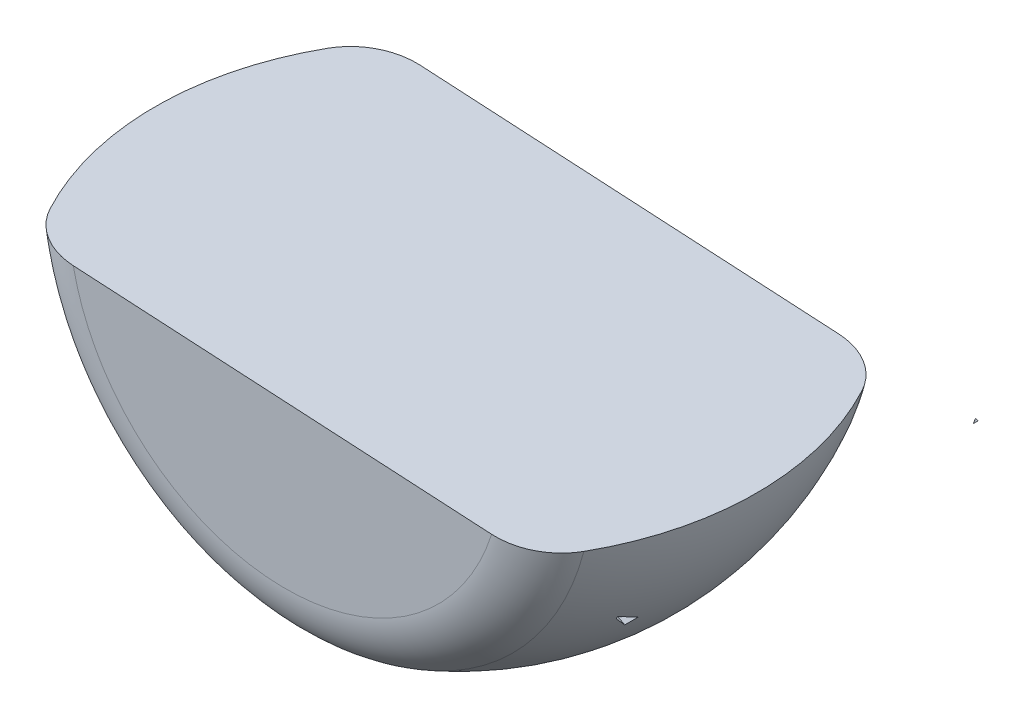
ISO-10303-21;
HEADER;
FILE_DESCRIPTION(('STEP AP214'),'2;1');
FILE_NAME('part.step','',(''),(''),'','','');
FILE_SCHEMA(('AUTOMOTIVE_DESIGN { 1 0 10303 214 1 1 1 1 }'));
ENDSEC;
DATA;
#1=APPLICATION_CONTEXT('core data for automotive mechanical design processes');
#2=APPLICATION_PROTOCOL_DEFINITION('international standard','automotive_design',2000,#1);
#3=PRODUCT_CONTEXT('',#1,'mechanical');
#4=PRODUCT('Part','Part','',(#3));
#5=PRODUCT_RELATED_PRODUCT_CATEGORY('part','',(#4));
#6=PRODUCT_DEFINITION_FORMATION('','',#4);
#7=PRODUCT_DEFINITION_CONTEXT('part definition',#1,'design');
#8=PRODUCT_DEFINITION('design','',#6,#7);
#9=PRODUCT_DEFINITION_SHAPE('','',#8);
#10=(LENGTH_UNIT() NAMED_UNIT(*) SI_UNIT(.MILLI.,.METRE.));
#11=(NAMED_UNIT(*) PLANE_ANGLE_UNIT() SI_UNIT($,.RADIAN.));
#12=(NAMED_UNIT(*) SI_UNIT($,.STERADIAN.) SOLID_ANGLE_UNIT());
#13=UNCERTAINTY_MEASURE_WITH_UNIT(LENGTH_MEASURE(1.E-05),#10,'distance_accuracy_value','');
#14=(GEOMETRIC_REPRESENTATION_CONTEXT(3) GLOBAL_UNCERTAINTY_ASSIGNED_CONTEXT((#13)) GLOBAL_UNIT_ASSIGNED_CONTEXT((#10,
#11,#12)) REPRESENTATION_CONTEXT('',''));
#15=CARTESIAN_POINT('',(0.,0.,0.));
#16=DIRECTION('',(0.,0.,1.));
#17=DIRECTION('',(1.,0.,0.));
#18=AXIS2_PLACEMENT_3D('',#15,#16,#17);
#19=CARTESIAN_POINT('',(0.,0.,-8.55000000000001));
#20=DIRECTION('',(0.,0.,1.));
#21=DIRECTION('',(1.,0.,0.));
#22=AXIS2_PLACEMENT_3D('',#19,#20,#21);
#23=PLANE('',#22);
#24=DIRECTION('',(-0.998432153015849,0.0559753144174939,0.));
#25=VECTOR('',#24,1.);
#26=CARTESIAN_POINT('',(0.129132371159145,2.30333518805877,-8.55000000000001));
#27=LINE('',#26,#25);
#28=CARTESIAN_POINT('',(18.1091829067,1.29531578590981,-8.55000000000001));
#29=VERTEX_POINT('',#28);
#30=CARTESIAN_POINT('',(-16.9696653101634,3.26194872377285,-8.55000000000001));
#31=VERTEX_POINT('',#30);
#32=EDGE_CURVE('E213',#29,#31,#27,.T.);
#33=ORIENTED_EDGE('',*,*,#32,.F.);
#34=CARTESIAN_POINT('',(0.826261676156741,6.85387624033769,-8.55000000000001));
#35=DIRECTION('',(0.,0.,1.));
#36=DIRECTION('',(1.,0.,0.));
#37=AXIS2_PLACEMENT_3D('',#34,#35,#36);
#38=CIRCLE('',#37,18.154805440618);
#39=EDGE_CURVE('E217',#29,#31,#38,.F.);
#40=ORIENTED_EDGE('',*,*,#39,.T.);
#41=EDGE_LOOP('',(#33,#40));
#42=FACE_BOUND('',#41,.T.);
#43=ADVANCED_FACE('F160',(#42),#23,.F.);
#44=CARTESIAN_POINT('',(0.125498784377637,2.23852287014352,20.55));
#45=DIRECTION('',(0.,0.,-1.));
#46=DIRECTION('',(-1.,0.,0.));
#47=AXIS2_PLACEMENT_3D('',#44,#45,#46);
#48=PLANE('',#47);
#49=DIRECTION('',(-0.998432153015849,0.0559753144174939,0.));
#50=VECTOR('',#49,1.);
#51=CARTESIAN_POINT('',(0.129132371159145,2.30333518805877,20.55));
#52=LINE('',#51,#50);
#53=CARTESIAN_POINT('',(18.1091829067,1.29531578590981,20.55));
#54=VERTEX_POINT('',#53);
#55=CARTESIAN_POINT('',(-16.9696653101634,3.26194872377285,20.55));
#56=VERTEX_POINT('',#55);
#57=EDGE_CURVE('E181',#54,#56,#52,.T.);
#58=ORIENTED_EDGE('',*,*,#57,.T.);
#59=CARTESIAN_POINT('',(0.826261676156741,6.85387624033769,20.55));
#60=DIRECTION('',(0.,0.,-1.));
#61=DIRECTION('',(-1.,0.,0.));
#62=AXIS2_PLACEMENT_3D('',#59,#60,#61);
#63=CIRCLE('',#62,18.154805440618);
#64=EDGE_CURVE('E211',#56,#54,#63,.F.);
#65=ORIENTED_EDGE('',*,*,#64,.T.);
#66=EDGE_LOOP('',(#58,#65));
#67=FACE_BOUND('',#66,.T.);
#68=ADVANCED_FACE('F210',(#67),#48,.F.);
#69=CARTESIAN_POINT('',(0.826261676156741,6.85387624033769,5.99999999999999));
#70=DIRECTION('',(0.,0.,1.));
#71=DIRECTION('',(-0.996032291105332,-0.088992556292444,0.));
#72=AXIS2_PLACEMENT_3D('',#69,#70,#71);
#73=SPHERICAL_SURFACE('',#72,25.6754622177435);
#74=CARTESIAN_POINT('',(0.56975879826831,2.27863225484133,5.99999999999999));
#75=DIRECTION('',(0.0559753144174939,0.998432153015849,0.));
#76=DIRECTION('',(-0.998432153015849,0.0559753144174939,0.));
#77=AXIS2_PLACEMENT_3D('',#74,#75,#76);
#78=CIRCLE('',#77,25.2632283930932);
#79=CARTESIAN_POINT('',(-21.8086340431101,3.53323685833958,-5.65608038610815));
#80=VERTEX_POINT('',#79);
#81=CARTESIAN_POINT('',(-21.8086340431116,3.53323685833966,17.6560803861092));
#82=VERTEX_POINT('',#81);
#83=EDGE_CURVE('E187',#80,#82,#78,.T.);
#84=ORIENTED_EDGE('',*,*,#83,.F.);
#85=CARTESIAN_POINT('',(0.826261676156741,6.85387624033769,-5.65608038610814));
#86=DIRECTION('',(0.,0.,1.));
#87=DIRECTION('',(1.,0.,0.));
#88=AXIS2_PLACEMENT_3D('',#85,#86,#87);
#89=CIRCLE('',#88,22.8771753091888);
#90=CARTESIAN_POINT('',(22.9481516396467,1.02402765134308,-5.65608038610814));
#91=VERTEX_POINT('',#90);
#92=EDGE_CURVE('E224',#80,#91,#89,.T.);
#93=ORIENTED_EDGE('',*,*,#92,.T.);
#94=CARTESIAN_POINT('',(22.9481516396467,1.02402765134308,17.6560803861081));
#95=VERTEX_POINT('',#94);
#96=EDGE_CURVE('E266',#95,#91,#78,.T.);
#97=ORIENTED_EDGE('',*,*,#96,.F.);
#98=CARTESIAN_POINT('',(0.826261676156741,6.85387624033769,17.6560803861081));
#99=DIRECTION('',(0.,0.,-1.));
#100=DIRECTION('',(-1.,0.,0.));
#101=AXIS2_PLACEMENT_3D('',#98,#99,#100);
#102=CIRCLE('',#101,22.8771753091888);
#103=EDGE_CURVE('E268',#95,#82,#102,.T.);
#104=ORIENTED_EDGE('',*,*,#103,.T.);
#105=EDGE_LOOP('',(#84,#93,#97,#104));
#106=FACE_BOUND('',#105,.T.);
#107=ADVANCED_FACE('F243',(#106),#73,.T.);
#108=CARTESIAN_POINT('',(0.826261676156741,6.85387624033769,-3.25000000000001));
#109=DIRECTION('',(0.,0.,1.));
#110=DIRECTION('',(1.,0.,0.));
#111=AXIS2_PLACEMENT_3D('',#108,#109,#110);
#112=TOROIDAL_SURFACE('',#111,18.154805440618,5.3);
#113=CARTESIAN_POINT('',(-16.9696653101634,3.26194872377285,-8.55000000000001));
#114=CARTESIAN_POINT('',(-17.1256787658121,3.27069533936102,-8.55001482433052));
#115=CARTESIAN_POINT('',(-17.2816969424525,3.27944221962315,-8.54353039531665));
#116=CARTESIAN_POINT('',(-17.5926681468622,3.29687626447941,-8.51760011258737));
#117=CARTESIAN_POINT('',(-17.7476210853061,3.30556342406568,-8.4981531849808));
#118=CARTESIAN_POINT('',(-18.0553608761441,3.32281630549473,-8.44633501946241));
#119=CARTESIAN_POINT('',(-18.2081477304032,3.33138202744207,-8.41396379267852));
#120=CARTESIAN_POINT('',(-18.5104505987456,3.34833009752741,-8.33644732990927));
#121=CARTESIAN_POINT('',(-18.6599667697709,3.3567124544641,-8.29130270830324));
#122=CARTESIAN_POINT('',(-18.9547935918192,3.37324139337398,-8.18842033777883));
#123=CARTESIAN_POINT('',(-19.1000996984711,3.38138772057514,-8.13066951617046));
#124=CARTESIAN_POINT('',(-19.385253243436,3.39737434449191,-8.00293632378373));
#125=CARTESIAN_POINT('',(-19.5251006703919,3.40521464057081,-7.93295392755856));
#126=CARTESIAN_POINT('',(-19.7982742754338,3.42052963056446,-7.7811856290846));
#127=CARTESIAN_POINT('',(-19.9315999710766,3.4280042974319,-7.69939885537312));
#128=CARTESIAN_POINT('',(-20.1906681270639,3.44252849063135,-7.52456450837469));
#129=CARTESIAN_POINT('',(-20.3164110661033,3.44957804380054,-7.43151764704788));
#130=CARTESIAN_POINT('',(-20.556980041534,3.46306511350092,-7.2366889601152));
#131=CARTESIAN_POINT('',(-20.6719695274595,3.46951179353816,-7.13510954903656));
#132=CARTESIAN_POINT('',(-20.8927934900615,3.4818918943795,-6.92242140821484));
#133=CARTESIAN_POINT('',(-20.9986284985892,3.48782534500088,-6.81131323281591));
#134=CARTESIAN_POINT('',(-21.2001308149967,3.49912221227692,-6.5805486796643));
#135=CARTESIAN_POINT('',(-21.2958152999322,3.50448659193253,-6.46090733508248));
#136=CARTESIAN_POINT('',(-21.4764149844249,3.51461159050419,-6.2138127239095));
#137=CARTESIAN_POINT('',(-21.5613369383629,3.51937258809252,-6.08636443207877));
#138=CARTESIAN_POINT('',(-21.6701882999004,3.52547514515504,-5.90649510556245));
#139=CARTESIAN_POINT('',(-21.6990407071703,3.52709270380813,-5.85701261974586));
#140=CARTESIAN_POINT('',(-21.7550804451243,3.5302344715711,-5.7571920202053));
#141=CARTESIAN_POINT('',(-21.7822698100869,3.53175879472915,-5.70685505211208));
#142=CARTESIAN_POINT('',(-21.8086340431101,3.53323685833958,-5.65608038610814));
#143=B_SPLINE_CURVE_WITH_KNOTS('',3,(#113,#114,#115,#116,#117,#118,#119,#120,#121,#122,#123,
#124,#125,#126,#127,#128,#129,#130,#131,#132,#133,#134,#135,#136,#137,#138,#139,#140,#141,#142),
.UNSPECIFIED.,.F.,.F.,(4,2,2,2,2,2,2,2,2,2,2,2,2,2,4),(0.,0.468648058407676,0.937334947259083,
1.40602143256798,1.87468537865678,2.34383766011885,2.81299091762602,3.28217882828491,
3.75133708831051,4.21147217405171,4.67158050916942,5.1308973775576,5.58992454383809,
5.76180889021346,5.93347859538394),.UNSPECIFIED.);
#144=EDGE_CURVE('E221',#31,#80,#143,.T.);
#145=ORIENTED_EDGE('',*,*,#144,.F.);
#146=ORIENTED_EDGE('',*,*,#39,.F.);
#147=CARTESIAN_POINT('',(22.9481516396467,1.02402765134308,-5.65608038610814));
#148=CARTESIAN_POINT('',(22.8791205738024,1.02789775468815,-5.78906738389804));
#149=CARTESIAN_POINT('',(22.8043770049273,1.03208811930715,-5.91907063165377));
#150=CARTESIAN_POINT('',(22.644125947754,1.04107230845202,-6.17221746019535));
#151=CARTESIAN_POINT('',(22.5586200172717,1.04586604564171,-6.29536203003823));
#152=CARTESIAN_POINT('',(22.3776539264006,1.05601158613219,-6.53371578201796));
#153=CARTESIAN_POINT('',(22.2822126316176,1.06136233176649,-6.64893933791777));
#154=CARTESIAN_POINT('',(22.0819777963415,1.07258813997795,-6.87092349782591));
#155=CARTESIAN_POINT('',(21.9771841688112,1.07846320743471,-6.97768402305583));
#156=CARTESIAN_POINT('',(21.7590636983975,1.09069174181776,-7.18200422283819));
#157=CARTESIAN_POINT('',(21.6457391907857,1.09704507782123,-7.27956639902427));
#158=CARTESIAN_POINT('',(21.4113309394722,1.11018675753346,-7.46492811703339));
#159=CARTESIAN_POINT('',(21.2902445128021,1.11697525165805,-7.55272425415191));
#160=CARTESIAN_POINT('',(21.041193338978,1.1309378606533,-7.71799361789004));
#161=CARTESIAN_POINT('',(20.9132266092826,1.13811208667161,-7.79546384651136));
#162=CARTESIAN_POINT('',(20.6513596027075,1.1527931924276,-7.93959146972177));
#163=CARTESIAN_POINT('',(20.5174591818864,1.16030008023511,-8.00624860182025));
#164=CARTESIAN_POINT('',(20.2423590765729,1.17572307602375,-8.12940335475971));
#165=CARTESIAN_POINT('',(20.1010742809344,1.1836439556092,-8.18571025583881));
#166=CARTESIAN_POINT('',(19.8143909211821,1.19971634585817,-8.28642526333083));
#167=CARTESIAN_POINT('',(19.6689936809068,1.20786778230307,-8.33083715174082));
#168=CARTESIAN_POINT('',(19.3751982896949,1.22433889588632,-8.40752788457482));
#169=CARTESIAN_POINT('',(19.2268031355116,1.23265840501706,-8.43981826922203));
#170=CARTESIAN_POINT('',(18.9279376462518,1.24941376458689,-8.49217654338016));
#171=CARTESIAN_POINT('',(18.7774683266254,1.25784955809658,-8.51225021069916));
#172=CARTESIAN_POINT('',(18.5404154814424,1.2711395022381,-8.53413937553156));
#173=CARTESIAN_POINT('',(18.4541926230555,1.27597343270959,-8.54009441299618));
#174=CARTESIAN_POINT('',(18.2817102480092,1.28564334883312,-8.54802148659344));
#175=CARTESIAN_POINT('',(18.195451038521,1.29047931726414,-8.55000022439096));
#176=CARTESIAN_POINT('',(18.1091829067,1.29531578590981,-8.55000000000001));
#177=B_SPLINE_CURVE_WITH_KNOTS('',3,(#147,#148,#149,#150,#151,#152,#153,#154,#155,#156,#157,
#158,#159,#160,#161,#162,#163,#164,#165,#166,#167,#168,#169,#170,#171,#172,#173,#174,#175,#176),
.UNSPECIFIED.,.F.,.F.,(4,2,2,2,2,2,2,2,2,2,2,2,2,2,4),(0.,0.449509095355429,0.898953200429437,
1.34755893657672,1.79616884809569,2.24465639911111,2.69329981815641,3.14207321277775,
3.59085749985546,4.047225738026,4.50344870205021,4.95923621280154,5.41480799429213,
5.6744159188896,5.93358593146417),.UNSPECIFIED.);
#178=EDGE_CURVE('E216',#91,#29,#177,.T.);
#179=ORIENTED_EDGE('',*,*,#178,.F.);
#180=ORIENTED_EDGE('',*,*,#92,.F.);
#181=EDGE_LOOP('',(#145,#146,#179,#180));
#182=FACE_BOUND('',#181,.T.);
#183=ADVANCED_FACE('F239',(#182),#112,.T.);
#184=CARTESIAN_POINT('',(0.826261676156741,6.85387624033769,15.25));
#185=DIRECTION('',(0.,0.,-1.));
#186=DIRECTION('',(-1.,0.,0.));
#187=AXIS2_PLACEMENT_3D('',#184,#185,#186);
#188=TOROIDAL_SURFACE('',#187,18.154805440618,5.3);
#189=CARTESIAN_POINT('',(-21.8086340431101,3.53323685833958,17.6560803861081));
#190=CARTESIAN_POINT('',(-21.7396029772658,3.52936675499451,17.789067383898));
#191=CARTESIAN_POINT('',(-21.6648594083907,3.52517639037551,17.9190706316538));
#192=CARTESIAN_POINT('',(-21.5046083512174,3.51619220123064,18.1722174601953));
#193=CARTESIAN_POINT('',(-21.4191024207351,3.51139846404094,18.2953620300382));
#194=CARTESIAN_POINT('',(-21.238136329864,3.50125292355046,18.5337157820179));
#195=CARTESIAN_POINT('',(-21.1426950350809,3.49590217791617,18.6489393379178));
#196=CARTESIAN_POINT('',(-20.9424601998049,3.4846763697047,18.8709234978259));
#197=CARTESIAN_POINT('',(-20.8376665722746,3.47880130224795,18.9776840230558));
#198=CARTESIAN_POINT('',(-20.6195461018609,3.4665727678649,19.1820042228382));
#199=CARTESIAN_POINT('',(-20.506221594249,3.46021943186143,19.2795663990243));
#200=CARTESIAN_POINT('',(-20.2718133429356,3.4470777521492,19.4649281170334));
#201=CARTESIAN_POINT('',(-20.1507269162655,3.44028925802461,19.5527242541519));
#202=CARTESIAN_POINT('',(-19.9016757424414,3.42632664902936,19.71799361789));
#203=CARTESIAN_POINT('',(-19.773709012746,3.41915242301105,19.7954638465113));
#204=CARTESIAN_POINT('',(-19.5118420061709,3.40447131725506,19.9395914697218));
#205=CARTESIAN_POINT('',(-19.3779415853498,3.39696442944755,20.0062486018202));
#206=CARTESIAN_POINT('',(-19.1028414800362,3.38154143365891,20.1294033547597));
#207=CARTESIAN_POINT('',(-18.9615566843978,3.37362055407346,20.1857102558388));
#208=CARTESIAN_POINT('',(-18.6748733246455,3.35754816382448,20.2864252633308));
#209=CARTESIAN_POINT('',(-18.5294760843702,3.34939672737959,20.3308371517408));
#210=CARTESIAN_POINT('',(-18.2356806931583,3.33292561379634,20.4075278845748));
#211=CARTESIAN_POINT('',(-18.087285538975,3.32460610466559,20.439818269222));
#212=CARTESIAN_POINT('',(-17.7884200497152,3.30785074509577,20.4921765433802));
#213=CARTESIAN_POINT('',(-17.6379507300888,3.29941495158608,20.5122502106991));
#214=CARTESIAN_POINT('',(-17.4008978849058,3.28612500744456,20.5341393755315));
#215=CARTESIAN_POINT('',(-17.3146750265189,3.28129107697307,20.5400944129962));
#216=CARTESIAN_POINT('',(-17.1421926514725,3.27162116084954,20.5480214865934));
#217=CARTESIAN_POINT('',(-17.0559334419844,3.26678519241852,20.5500002243909));
#218=CARTESIAN_POINT('',(-16.9696653101634,3.26194872377285,20.55));
#219=B_SPLINE_CURVE_WITH_KNOTS('',3,(#189,#190,#191,#192,#193,#194,#195,#196,#197,#198,#199,
#200,#201,#202,#203,#204,#205,#206,#207,#208,#209,#210,#211,#212,#213,#214,#215,#216,#217,#218),
.UNSPECIFIED.,.F.,.F.,(4,2,2,2,2,2,2,2,2,2,2,2,2,2,4),(0.,0.449509095355429,0.898953200429435,
1.34755893657672,1.79616884809569,2.24465639911111,2.6932998181564,3.14207321277775,
3.59085749985546,4.047225738026,4.50344870205021,4.95923621280154,5.41480799429213,
5.6744159188896,5.93358593146417),.UNSPECIFIED.);
#220=EDGE_CURVE('E13',#82,#56,#219,.T.);
#221=ORIENTED_EDGE('',*,*,#220,.F.);
#222=ORIENTED_EDGE('',*,*,#103,.F.);
#223=CARTESIAN_POINT('',(18.1091829067,1.29531578590981,20.55));
#224=CARTESIAN_POINT('',(18.2651963623487,1.28656917032164,20.5500148243305));
#225=CARTESIAN_POINT('',(18.4212145389891,1.27782229005951,20.5435303953166));
#226=CARTESIAN_POINT('',(18.7321857433988,1.26038824520324,20.5176001125874));
#227=CARTESIAN_POINT('',(18.8871386818427,1.25170108561697,20.4981531849808));
#228=CARTESIAN_POINT('',(19.1948784726807,1.23444820418792,20.4463350194624));
#229=CARTESIAN_POINT('',(19.3476653269398,1.22588248224059,20.4139637926785));
#230=CARTESIAN_POINT('',(19.6499681952822,1.20893441215525,20.3364473299093));
#231=CARTESIAN_POINT('',(19.7994843663075,1.20055205521856,20.2913027083032));
#232=CARTESIAN_POINT('',(20.0943111883558,1.18402311630868,20.1884203377788));
#233=CARTESIAN_POINT('',(20.2396172950077,1.17587678910752,20.1306695161704));
#234=CARTESIAN_POINT('',(20.5247708399726,1.15989016519075,20.0029363237837));
#235=CARTESIAN_POINT('',(20.6646182669286,1.15204986911185,19.9329539275586));
#236=CARTESIAN_POINT('',(20.9377918719704,1.1367348791182,19.7811856290846));
#237=CARTESIAN_POINT('',(21.0711175676133,1.12926021225076,19.6993988553731));
#238=CARTESIAN_POINT('',(21.3301857236005,1.1147360190513,19.5245645083747));
#239=CARTESIAN_POINT('',(21.4559286626399,1.10768646588212,19.4315176470479));
#240=CARTESIAN_POINT('',(21.6964976380706,1.09419939618173,19.2366889601152));
#241=CARTESIAN_POINT('',(21.8114871239961,1.08775271614449,19.1351095490365));
#242=CARTESIAN_POINT('',(22.0323110865982,1.07537261530316,18.9224214082148));
#243=CARTESIAN_POINT('',(22.1381460951258,1.06943916468178,18.8113132328159));
#244=CARTESIAN_POINT('',(22.3396484115333,1.05814229740573,18.5805486796643));
#245=CARTESIAN_POINT('',(22.4353328964688,1.05277791775013,18.4609073350825));
#246=CARTESIAN_POINT('',(22.6159325809615,1.04265291917847,18.2138127239095));
#247=CARTESIAN_POINT('',(22.7008545348995,1.03789192159014,18.0863644320788));
#248=CARTESIAN_POINT('',(22.809705896437,1.03178936452762,17.9064951055624));
#249=CARTESIAN_POINT('',(22.8385583037069,1.03017180587453,17.8570126197459));
#250=CARTESIAN_POINT('',(22.8945980416609,1.02703003811156,17.7571920202053));
#251=CARTESIAN_POINT('',(22.9217874066235,1.0255057149535,17.7068550521121));
#252=CARTESIAN_POINT('',(22.9481516396467,1.02402765134308,17.6560803861081));
#253=B_SPLINE_CURVE_WITH_KNOTS('',3,(#223,#224,#225,#226,#227,#228,#229,#230,#231,#232,#233,
#234,#235,#236,#237,#238,#239,#240,#241,#242,#243,#244,#245,#246,#247,#248,#249,#250,#251,#252),
.UNSPECIFIED.,.F.,.F.,(4,2,2,2,2,2,2,2,2,2,2,2,2,2,4),(0.,0.468648058407676,0.937334947259083,
1.40602143256799,1.87468537865678,2.34383766011885,2.81299091762602,3.28217882828491,
3.7513370883105,4.2114721740517,4.67158050916941,5.1308973775576,5.58992454383809,
5.76180889021346,5.93347859538393),.UNSPECIFIED.);
#254=EDGE_CURVE('E175',#54,#95,#253,.T.);
#255=ORIENTED_EDGE('',*,*,#254,.F.);
#256=ORIENTED_EDGE('',*,*,#64,.F.);
#257=EDGE_LOOP('',(#221,#222,#255,#256));
#258=FACE_BOUND('',#257,.T.);
#259=ADVANCED_FACE('F162',(#258),#188,.T.);
#260=CARTESIAN_POINT('',(0.129132371159145,2.30333518805877,-27.7));
#261=DIRECTION('',(0.0559753144174939,0.998432153015849,0.));
#262=DIRECTION('',(-0.998432153015849,0.0559753144174939,0.));
#263=AXIS2_PLACEMENT_3D('',#260,#261,#262);
#264=PLANE('',#263);
#265=ORIENTED_EDGE('',*,*,#83,.T.);
#266=ORIENTED_EDGE('',*,*,#220,.T.);
#267=ORIENTED_EDGE('',*,*,#57,.F.);
#268=ORIENTED_EDGE('',*,*,#254,.T.);
#269=ORIENTED_EDGE('',*,*,#96,.T.);
#270=ORIENTED_EDGE('',*,*,#178,.T.);
#271=ORIENTED_EDGE('',*,*,#32,.T.);
#272=ORIENTED_EDGE('',*,*,#144,.T.);
#273=EDGE_LOOP('',(#265,#266,#267,#268,#269,#270,#271,#272));
#274=FACE_BOUND('',#273,.T.);
#275=ADVANCED_FACE('F204',(#274),#264,.T.);
#276=CLOSED_SHELL('',(#43,#68,#107,#183,#259,#275));
#277=MANIFOLD_SOLID_BREP('B2',#276);
#278=CARTESIAN_POINT('',(6.56743620719669,12.4703762315739,0.));
#279=DIRECTION('',(0.46597312350684,0.884798874416824,0.));
#280=DIRECTION('',(-0.884798874416825,0.46597312350684,0.));
#281=AXIS2_PLACEMENT_3D('',#278,#279,#280);
#282=PLANE('',#281);
#283=CARTESIAN_POINT('',(6.71596543258528,12.3921543564252,5.5));
#284=DIRECTION('',(0.46597312350684,0.884798874416824,0.));
#285=DIRECTION('',(-0.884798874416825,0.46597312350684,0.));
#286=AXIS2_PLACEMENT_3D('',#283,#284,#285);
#287=CIRCLE('',#286,29.2383955365075);
#288=CARTESIAN_POINT('',(29.4127707622441,0.439040966606995,-8.53074772301838));
#289=VERTEX_POINT('',#288);
#290=CARTESIAN_POINT('',(29.2173876128529,0.541938132318668,-8.92713238507726));
#291=VERTEX_POINT('',#290);
#292=EDGE_CURVE('E389',#289,#291,#287,.T.);
#293=ORIENTED_EDGE('',*,*,#292,.F.);
#294=DIRECTION('',(0.,0.,-1.));
#295=VECTOR('',#294,1.);
#296=CARTESIAN_POINT('',(29.4127707622441,0.439040966606985,0.));
#297=LINE('',#296,#295);
#298=CARTESIAN_POINT('',(29.4127707622441,0.43904096660698,-8.92713238507726));
#299=VERTEX_POINT('',#298);
#300=EDGE_CURVE('E360',#289,#299,#297,.T.);
#301=ORIENTED_EDGE('',*,*,#300,.T.);
#302=DIRECTION('',(0.884798874416825,-0.46597312350684,0.));
#303=VECTOR('',#302,1.);
#304=CARTESIAN_POINT('',(6.56743620719669,12.4703762315739,-8.92713238507726));
#305=LINE('',#304,#303);
#306=EDGE_CURVE('E385',#291,#299,#305,.T.);
#307=ORIENTED_EDGE('',*,*,#306,.F.);
#308=EDGE_LOOP('',(#293,#301,#307));
#309=FACE_BOUND('',#308,.T.);
#310=ADVANCED_FACE('F356',(#309),#282,.T.);
#311=CARTESIAN_POINT('',(6.64976316597345,12.5464166409985,-8.92713238507726));
#312=DIRECTION('',(0.,0.,1.));
#313=DIRECTION('',(1.,0.,0.));
#314=AXIS2_PLACEMENT_3D('',#311,#312,#313);
#315=PLANE('',#314);
#316=DIRECTION('',(0.99244322304936,-0.122704722905834,0.));
#317=VECTOR('',#316,1.);
#318=CARTESIAN_POINT('',(5.51808764321699,3.39335654149112,-8.92713238507726));
#319=LINE('',#318,#317);
#320=CARTESIAN_POINT('',(29.1783088908079,0.468029606257483,-8.92713238507726));
#321=VERTEX_POINT('',#320);
#322=EDGE_CURVE('E158',#321,#299,#319,.T.);
#323=ORIENTED_EDGE('',*,*,#322,.F.);
#324=CARTESIAN_POINT('',(6.71596543258528,12.3921543564252,-8.92713238507726));
#325=DIRECTION('',(0.,0.,1.));
#326=DIRECTION('',(1.,0.,0.));
#327=AXIS2_PLACEMENT_3D('',#324,#325,#326);
#328=CIRCLE('',#327,25.4311152860569);
#329=EDGE_CURVE('E381',#321,#291,#328,.T.);
#330=ORIENTED_EDGE('',*,*,#329,.T.);
#331=ORIENTED_EDGE('',*,*,#306,.T.);
#332=EDGE_LOOP('',(#323,#330,#331));
#333=FACE_BOUND('',#332,.T.);
#334=ADVANCED_FACE('F383',(#333),#315,.F.);
#335=CARTESIAN_POINT('',(6.71596543258528,12.3921543564252,5.5));
#336=DIRECTION('',(0.,0.,1.));
#337=DIRECTION('',(0.394371483650668,-0.918951104729283,0.));
#338=AXIS2_PLACEMENT_3D('',#335,#336,#337);
#339=SPHERICAL_SURFACE('',#338,29.2383955365075);
#340=CARTESIAN_POINT('',(5.60207880961362,3.38297195468567,5.5));
#341=DIRECTION('',(-0.122704722905834,-0.99244322304936,0.));
#342=DIRECTION('',(0.99244322304936,-0.122704722905834,0.));
#343=AXIS2_PLACEMENT_3D('',#340,#341,#342);
#344=CIRCLE('',#343,27.7934823761366);
#345=EDGE_CURVE('E365',#289,#321,#344,.F.);
#346=ORIENTED_EDGE('',*,*,#345,.F.);
#347=ORIENTED_EDGE('',*,*,#292,.T.);
#348=ORIENTED_EDGE('',*,*,#329,.F.);
#349=EDGE_LOOP('',(#346,#347,#348));
#350=FACE_BOUND('',#349,.T.);
#351=ADVANCED_FACE('F390',(#350),#339,.F.);
#352=CARTESIAN_POINT('',(60.557008846498,-3.41160259212447,30.55));
#353=DIRECTION('',(-0.122704722905834,-0.99244322304936,0.));
#354=DIRECTION('',(0.99244322304936,-0.122704722905834,0.));
#355=AXIS2_PLACEMENT_3D('',#352,#353,#354);
#356=PLANE('',#355);
#357=ORIENTED_EDGE('',*,*,#345,.T.);
#358=ORIENTED_EDGE('',*,*,#322,.T.);
#359=ORIENTED_EDGE('',*,*,#300,.F.);
#360=EDGE_LOOP('',(#357,#358,#359));
#361=FACE_BOUND('',#360,.T.);
#362=ADVANCED_FACE('F358',(#361),#356,.T.);
#363=CLOSED_SHELL('',(#310,#334,#351,#362));
#364=MANIFOLD_SOLID_BREP('B7',#363);
#365=CARTESIAN_POINT('',(6.56743620719669,12.4703762315739,0.));
#366=DIRECTION('',(0.46597312350684,0.884798874416824,0.));
#367=DIRECTION('',(-0.884798874416825,0.46597312350684,0.));
#368=AXIS2_PLACEMENT_3D('',#365,#366,#367);
#369=PLANE('',#368);
#370=CARTESIAN_POINT('',(6.71596543258528,12.3921543564252,5.5));
#371=DIRECTION('',(0.46597312350684,0.884798874416824,0.));
#372=DIRECTION('',(-0.884798874416825,0.46597312350684,0.));
#373=AXIS2_PLACEMENT_3D('',#370,#371,#372);
#374=CIRCLE('',#373,29.2383955365075);
#375=CARTESIAN_POINT('',(28.9398236070233,0.688115269868453,20.4666085153611));
#376=VERTEX_POINT('',#375);
#377=CARTESIAN_POINT('',(29.4127707622441,0.439040966606996,19.5307477230184));
#378=VERTEX_POINT('',#377);
#379=EDGE_CURVE('E449',#376,#378,#374,.T.);
#380=ORIENTED_EDGE('',*,*,#379,.F.);
#381=DIRECTION('',(0.,0.,1.));
#382=VECTOR('',#381,1.);
#383=CARTESIAN_POINT('',(28.9398236070233,0.688115269868459,0.));
#384=LINE('',#383,#382);
#385=CARTESIAN_POINT('',(28.9398236070233,0.68811526986846,20.55));
#386=VERTEX_POINT('',#385);
#387=EDGE_CURVE('E474',#376,#386,#384,.T.);
#388=ORIENTED_EDGE('',*,*,#387,.T.);
#389=DIRECTION('',(0.884798874416825,-0.46597312350684,0.));
#390=VECTOR('',#389,1.);
#391=CARTESIAN_POINT('',(6.56743620719669,12.4703762315739,20.55));
#392=LINE('',#391,#390);
#393=CARTESIAN_POINT('',(28.8956915244673,0.711357121717596,20.55));
#394=VERTEX_POINT('',#393);
#395=EDGE_CURVE('E467',#394,#386,#392,.T.);
#396=ORIENTED_EDGE('',*,*,#395,.F.);
#397=CARTESIAN_POINT('',(28.8203229742945,0.751049440224803,20.6909784921038));
#398=VERTEX_POINT('',#397);
#399=EDGE_CURVE('E494',#398,#394,#374,.T.);
#400=ORIENTED_EDGE('',*,*,#399,.F.);
#401=DIRECTION('',(0.884798874416825,-0.46597312350684,0.));
#402=VECTOR('',#401,1.);
#403=CARTESIAN_POINT('',(6.56743620719669,12.4703762315739,20.6909784921038));
#404=LINE('',#403,#402);
#405=CARTESIAN_POINT('',(29.4127707622441,0.439040966606986,20.6909784921038));
#406=VERTEX_POINT('',#405);
#407=EDGE_CURVE('E491',#398,#406,#404,.T.);
#408=ORIENTED_EDGE('',*,*,#407,.T.);
#409=DIRECTION('',(0.,0.,-1.));
#410=VECTOR('',#409,1.);
#411=CARTESIAN_POINT('',(29.4127707622441,0.439040966606985,0.));
#412=LINE('',#411,#410);
#413=EDGE_CURVE('E480',#406,#378,#412,.T.);
#414=ORIENTED_EDGE('',*,*,#413,.T.);
#415=EDGE_LOOP('',(#380,#388,#396,#400,#408,#414));
#416=FACE_BOUND('',#415,.T.);
#417=ADVANCED_FACE('F428',(#416),#369,.T.);
#418=CARTESIAN_POINT('',(6.71596543258528,12.3921543564252,5.5));
#419=DIRECTION('',(0.,0.,1.));
#420=DIRECTION('',(0.394371483650668,-0.918951104729283,0.));
#421=AXIS2_PLACEMENT_3D('',#418,#419,#420);
#422=SPHERICAL_SURFACE('',#421,29.2383955365075);
#423=CARTESIAN_POINT('',(6.13148790833289,1.96682385133546,5.5));
#424=DIRECTION('',(0.0559753144174939,0.998432153015849,0.));
#425=DIRECTION('',(-0.998432153015849,0.0559753144174939,0.));
#426=AXIS2_PLACEMENT_3D('',#423,#424,#425);
#427=CIRCLE('',#426,27.3103394968381);
#428=CARTESIAN_POINT('',(28.8850566546067,0.691185681184783,20.55));
#429=VERTEX_POINT('',#428);
#430=EDGE_CURVE('E354',#376,#429,#427,.F.);
#431=ORIENTED_EDGE('',*,*,#430,.F.);
#432=ORIENTED_EDGE('',*,*,#379,.T.);
#433=CARTESIAN_POINT('',(5.60207880961362,3.38297195468567,5.5));
#434=DIRECTION('',(-0.122704722905834,-0.99244322304936,0.));
#435=DIRECTION('',(0.99244322304936,-0.122704722905834,0.));
#436=AXIS2_PLACEMENT_3D('',#433,#434,#435);
#437=CIRCLE('',#436,27.7934823761366);
#438=CARTESIAN_POINT('',(28.7009008231997,0.527055879285864,20.6909784921038));
#439=VERTEX_POINT('',#438);
#440=EDGE_CURVE('E487',#439,#378,#437,.F.);
#441=ORIENTED_EDGE('',*,*,#440,.F.);
#442=CARTESIAN_POINT('',(6.71596543258528,12.3921543564252,20.6909784921038));
#443=DIRECTION('',(0.,0.,1.));
#444=DIRECTION('',(1.,0.,0.));
#445=AXIS2_PLACEMENT_3D('',#442,#443,#444);
#446=CIRCLE('',#445,24.9823526914841);
#447=EDGE_CURVE('E489',#439,#398,#446,.T.);
#448=ORIENTED_EDGE('',*,*,#447,.T.);
#449=ORIENTED_EDGE('',*,*,#399,.T.);
#450=CARTESIAN_POINT('',(6.71596543258528,12.3921543564252,20.55));
#451=DIRECTION('',(0.,0.,1.));
#452=DIRECTION('',(1.,0.,0.));
#453=AXIS2_PLACEMENT_3D('',#450,#451,#452);
#454=CIRCLE('',#453,25.0675342534774);
#455=EDGE_CURVE('E435',#394,#429,#454,.F.);
#456=ORIENTED_EDGE('',*,*,#455,.T.);
#457=EDGE_LOOP('',(#431,#432,#441,#448,#449,#456));
#458=FACE_BOUND('',#457,.T.);
#459=ADVANCED_FACE('F495',(#458),#422,.F.);
#460=CARTESIAN_POINT('',(6.64976316597345,12.5464166409985,20.6909784921038));
#461=DIRECTION('',(0.,0.,1.));
#462=DIRECTION('',(1.,0.,0.));
#463=AXIS2_PLACEMENT_3D('',#460,#461,#462);
#464=PLANE('',#463);
#465=ORIENTED_EDGE('',*,*,#447,.F.);
#466=DIRECTION('',(0.99244322304936,-0.122704722905834,0.));
#467=VECTOR('',#466,1.);
#468=CARTESIAN_POINT('',(5.51808764321699,3.39335654149112,20.6909784921038));
#469=LINE('',#468,#467);
#470=EDGE_CURVE('E482',#439,#406,#469,.T.);
#471=ORIENTED_EDGE('',*,*,#470,.T.);
#472=ORIENTED_EDGE('',*,*,#407,.F.);
#473=EDGE_LOOP('',(#465,#471,#472));
#474=FACE_BOUND('',#473,.T.);
#475=ADVANCED_FACE('F499',(#474),#464,.T.);
#476=CARTESIAN_POINT('',(60.557008846498,-3.41160259212447,30.55));
#477=DIRECTION('',(-0.122704722905834,-0.99244322304936,0.));
#478=DIRECTION('',(0.99244322304936,-0.122704722905834,0.));
#479=AXIS2_PLACEMENT_3D('',#476,#477,#478);
#480=PLANE('',#479);
#481=ORIENTED_EDGE('',*,*,#440,.T.);
#482=ORIENTED_EDGE('',*,*,#413,.F.);
#483=ORIENTED_EDGE('',*,*,#470,.F.);
#484=EDGE_LOOP('',(#481,#482,#483));
#485=FACE_BOUND('',#484,.T.);
#486=ADVANCED_FACE('F501',(#485),#480,.T.);
#487=CARTESIAN_POINT('',(0.129132371159145,2.30333518805877,-27.7));
#488=DIRECTION('',(0.0559753144174939,0.998432153015849,0.));
#489=DIRECTION('',(-0.998432153015849,0.0559753144174939,0.));
#490=AXIS2_PLACEMENT_3D('',#487,#488,#489);
#491=PLANE('',#490);
#492=ORIENTED_EDGE('',*,*,#430,.T.);
#493=DIRECTION('',(-0.998432153015849,0.0559753144174939,0.));
#494=VECTOR('',#493,1.);
#495=CARTESIAN_POINT('',(0.129132371159145,2.30333518805877,20.55));
#496=LINE('',#495,#494);
#497=EDGE_CURVE('E442',#386,#429,#496,.T.);
#498=ORIENTED_EDGE('',*,*,#497,.F.);
#499=ORIENTED_EDGE('',*,*,#387,.F.);
#500=EDGE_LOOP('',(#492,#498,#499));
#501=FACE_BOUND('',#500,.T.);
#502=ADVANCED_FACE('F477',(#501),#491,.T.);
#503=CARTESIAN_POINT('',(0.,0.,20.55));
#504=DIRECTION('',(0.,0.,1.));
#505=DIRECTION('',(1.,0.,0.));
#506=AXIS2_PLACEMENT_3D('',#503,#504,#505);
#507=PLANE('',#506);
#508=ORIENTED_EDGE('',*,*,#395,.T.);
#509=ORIENTED_EDGE('',*,*,#497,.T.);
#510=ORIENTED_EDGE('',*,*,#455,.F.);
#511=EDGE_LOOP('',(#508,#509,#510));
#512=FACE_BOUND('',#511,.T.);
#513=ADVANCED_FACE('F468',(#512),#507,.F.);
#514=CLOSED_SHELL('',(#417,#459,#475,#486,#502,#513));
#515=MANIFOLD_SOLID_BREP('B152',#514);
#516=ADVANCED_BREP_SHAPE_REPRESENTATION('',(#18,#277,#364,#515),#14);
#517=SHAPE_DEFINITION_REPRESENTATION(#9,#516);
ENDSEC;
END-ISO-10303-21;
